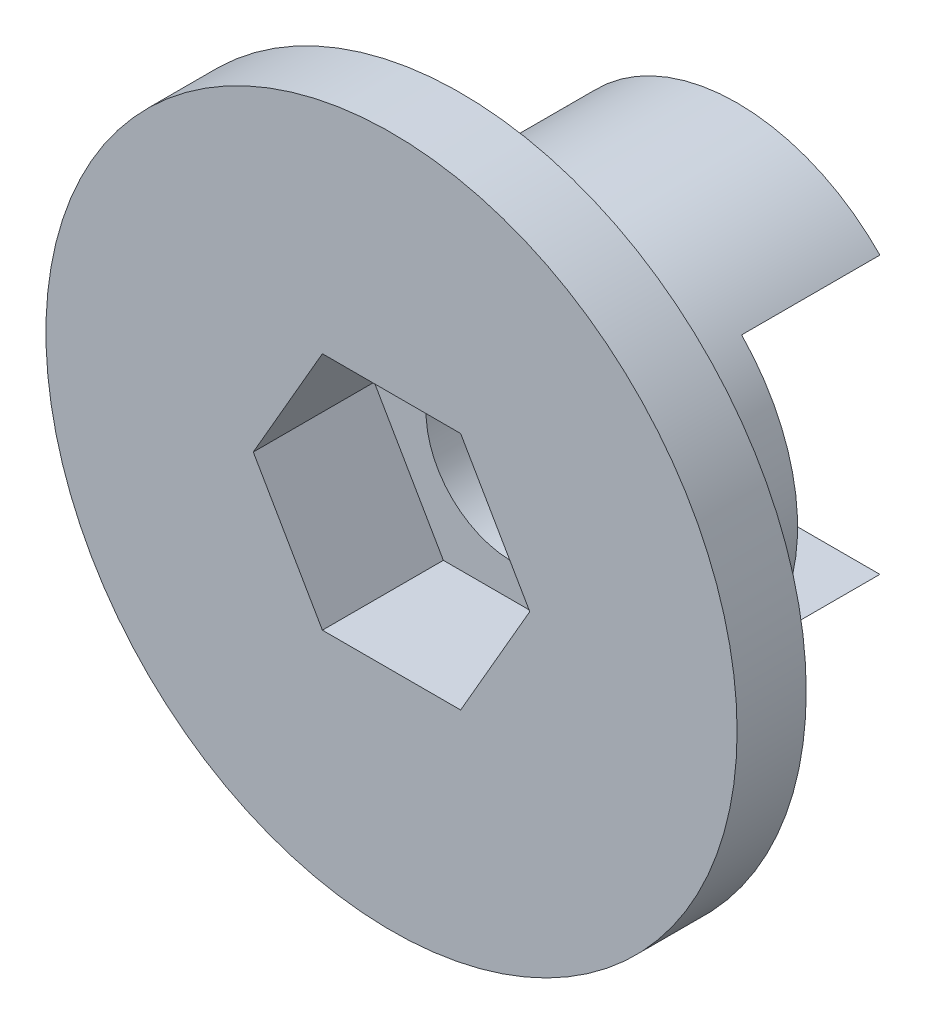
ISO-10303-21;
HEADER;
FILE_DESCRIPTION(('STEP AP214'),'2;1');
FILE_NAME('part.step','',(''),(''),'','','');
FILE_SCHEMA(('AUTOMOTIVE_DESIGN { 1 0 10303 214 1 1 1 1 }'));
ENDSEC;
DATA;
#1=APPLICATION_CONTEXT('core data for automotive mechanical design processes');
#2=APPLICATION_PROTOCOL_DEFINITION('international standard','automotive_design',2000,#1);
#3=PRODUCT_CONTEXT('',#1,'mechanical');
#4=PRODUCT('Part','Part','',(#3));
#5=PRODUCT_RELATED_PRODUCT_CATEGORY('part','',(#4));
#6=PRODUCT_DEFINITION_FORMATION('','',#4);
#7=PRODUCT_DEFINITION_CONTEXT('part definition',#1,'design');
#8=PRODUCT_DEFINITION('design','',#6,#7);
#9=PRODUCT_DEFINITION_SHAPE('','',#8);
#10=(LENGTH_UNIT() NAMED_UNIT(*) SI_UNIT(.MILLI.,.METRE.));
#11=(NAMED_UNIT(*) PLANE_ANGLE_UNIT() SI_UNIT($,.RADIAN.));
#12=(NAMED_UNIT(*) SI_UNIT($,.STERADIAN.) SOLID_ANGLE_UNIT());
#13=UNCERTAINTY_MEASURE_WITH_UNIT(LENGTH_MEASURE(1.E-05),#10,'distance_accuracy_value','');
#14=(GEOMETRIC_REPRESENTATION_CONTEXT(3) GLOBAL_UNCERTAINTY_ASSIGNED_CONTEXT((#13)) GLOBAL_UNIT_ASSIGNED_CONTEXT((#10,
#11,#12)) REPRESENTATION_CONTEXT('',''));
#15=CARTESIAN_POINT('',(0.,0.,0.));
#16=DIRECTION('',(0.,0.,1.));
#17=DIRECTION('',(1.,0.,0.));
#18=AXIS2_PLACEMENT_3D('',#15,#16,#17);
#19=CARTESIAN_POINT('',(0.,0.,20.));
#20=DIRECTION('',(0.,0.,-1.));
#21=DIRECTION('',(-1.,0.,0.));
#22=AXIS2_PLACEMENT_3D('',#19,#20,#21);
#23=CYLINDRICAL_SURFACE('',#22,11.5);
#24=CARTESIAN_POINT('',(0.,0.,8.));
#25=DIRECTION('',(0.,0.,1.));
#26=DIRECTION('',(1.,0.,0.));
#27=AXIS2_PLACEMENT_3D('',#24,#25,#26);
#28=CIRCLE('',#27,11.5);
#29=CARTESIAN_POINT('',(8.26135582092915,-8.,8.));
#30=VERTEX_POINT('',#29);
#31=CARTESIAN_POINT('',(8.26135582092915,8.,8.));
#32=VERTEX_POINT('',#31);
#33=EDGE_CURVE('E111',#30,#32,#28,.T.);
#34=ORIENTED_EDGE('',*,*,#33,.T.);
#35=DIRECTION('',(0.,0.,-1.));
#36=VECTOR('',#35,1.);
#37=CARTESIAN_POINT('',(8.26135582092915,8.,20.));
#38=LINE('',#37,#36);
#39=CARTESIAN_POINT('',(8.26135582092915,8.,0.));
#40=VERTEX_POINT('',#39);
#41=EDGE_CURVE('E40',#32,#40,#38,.T.);
#42=ORIENTED_EDGE('',*,*,#41,.T.);
#43=CARTESIAN_POINT('',(0.,0.,0.));
#44=DIRECTION('',(0.,0.,1.));
#45=DIRECTION('',(1.,0.,0.));
#46=AXIS2_PLACEMENT_3D('',#43,#44,#45);
#47=CIRCLE('',#46,11.5);
#48=CARTESIAN_POINT('',(-8.26135582092915,8.,0.));
#49=VERTEX_POINT('',#48);
#50=EDGE_CURVE('E119',#40,#49,#47,.T.);
#51=ORIENTED_EDGE('',*,*,#50,.T.);
#52=DIRECTION('',(0.,0.,-1.));
#53=VECTOR('',#52,1.);
#54=CARTESIAN_POINT('',(-8.26135582092915,8.,20.));
#55=LINE('',#54,#53);
#56=CARTESIAN_POINT('',(-8.26135582092915,8.,8.));
#57=VERTEX_POINT('',#56);
#58=EDGE_CURVE('E127',#49,#57,#55,.F.);
#59=ORIENTED_EDGE('',*,*,#58,.T.);
#60=CARTESIAN_POINT('',(-8.26135582092915,-8.,8.));
#61=VERTEX_POINT('',#60);
#62=EDGE_CURVE('E47',#57,#61,#28,.T.);
#63=ORIENTED_EDGE('',*,*,#62,.T.);
#64=DIRECTION('',(0.,0.,-1.));
#65=VECTOR('',#64,1.);
#66=CARTESIAN_POINT('',(-8.26135582092915,-8.,20.));
#67=LINE('',#66,#65);
#68=CARTESIAN_POINT('',(-8.26135582092915,-8.,0.));
#69=VERTEX_POINT('',#68);
#70=EDGE_CURVE('E192',#61,#69,#67,.T.);
#71=ORIENTED_EDGE('',*,*,#70,.T.);
#72=CARTESIAN_POINT('',(8.26135582092915,-8.,0.));
#73=VERTEX_POINT('',#72);
#74=EDGE_CURVE('E187',#69,#73,#47,.T.);
#75=ORIENTED_EDGE('',*,*,#74,.T.);
#76=DIRECTION('',(0.,0.,-1.));
#77=VECTOR('',#76,1.);
#78=CARTESIAN_POINT('',(8.26135582092915,-8.,20.));
#79=LINE('',#78,#77);
#80=EDGE_CURVE('E117',#73,#30,#79,.F.);
#81=ORIENTED_EDGE('',*,*,#80,.T.);
#82=EDGE_LOOP('',(#34,#42,#51,#59,#63,#71,#75,#81));
#83=FACE_BOUND('',#82,.T.);
#84=CARTESIAN_POINT('',(0.,0.,16.));
#85=DIRECTION('',(0.,0.,1.));
#86=DIRECTION('',(1.,0.,0.));
#87=AXIS2_PLACEMENT_3D('',#84,#85,#86);
#88=CIRCLE('',#87,11.5);
#89=CARTESIAN_POINT('',(11.5,0.,16.));
#90=VERTEX_POINT('',#89);
#91=EDGE_CURVE('E11',#90,#90,#88,.T.);
#92=ORIENTED_EDGE('',*,*,#91,.F.);
#93=EDGE_LOOP('',(#92));
#94=FACE_BOUND('',#93,.T.);
#95=ADVANCED_FACE('F33',(#83,#94),#23,.T.);
#96=CARTESIAN_POINT('',(0.,0.,0.));
#97=DIRECTION('',(0.,0.,1.));
#98=DIRECTION('',(1.,0.,0.));
#99=AXIS2_PLACEMENT_3D('',#96,#97,#98);
#100=PLANE('',#99);
#101=ORIENTED_EDGE('',*,*,#74,.F.);
#102=DIRECTION('',(1.,0.,0.));
#103=VECTOR('',#102,1.);
#104=CARTESIAN_POINT('',(-11.5,-8.,0.));
#105=LINE('',#104,#103);
#106=EDGE_CURVE('E131',#69,#73,#105,.T.);
#107=ORIENTED_EDGE('',*,*,#106,.T.);
#108=EDGE_LOOP('',(#101,#107));
#109=FACE_BOUND('',#108,.T.);
#110=ADVANCED_FACE('F200',(#109),#100,.F.);
#111=CARTESIAN_POINT('',(0.,0.,20.));
#112=DIRECTION('',(0.,0.,-1.));
#113=DIRECTION('',(-1.,0.,0.));
#114=AXIS2_PLACEMENT_3D('',#111,#112,#113);
#115=CYLINDRICAL_SURFACE('',#114,5.);
#116=CARTESIAN_POINT('',(0.,0.,8.));
#117=DIRECTION('',(0.,0.,1.));
#118=DIRECTION('',(1.,0.,0.));
#119=AXIS2_PLACEMENT_3D('',#116,#117,#118);
#120=CIRCLE('',#119,5.);
#121=CARTESIAN_POINT('',(5.,0.,8.));
#122=VERTEX_POINT('',#121);
#123=EDGE_CURVE('E137',#122,#122,#120,.T.);
#124=ORIENTED_EDGE('',*,*,#123,.F.);
#125=EDGE_LOOP('',(#124));
#126=FACE_BOUND('',#125,.T.);
#127=CARTESIAN_POINT('',(0.,0.,13.));
#128=DIRECTION('',(0.,0.,1.));
#129=DIRECTION('',(1.,0.,0.));
#130=AXIS2_PLACEMENT_3D('',#127,#128,#129);
#131=CIRCLE('',#130,5.);
#132=CARTESIAN_POINT('',(5.,0.,13.));
#133=VERTEX_POINT('',#132);
#134=EDGE_CURVE('E177',#133,#133,#131,.T.);
#135=ORIENTED_EDGE('',*,*,#134,.T.);
#136=EDGE_LOOP('',(#135));
#137=FACE_BOUND('',#136,.T.);
#138=ADVANCED_FACE('F207',(#126,#137),#115,.F.);
#139=CARTESIAN_POINT('',(0.,0.,20.));
#140=DIRECTION('',(0.,0.,1.));
#141=DIRECTION('',(1.,0.,0.));
#142=AXIS2_PLACEMENT_3D('',#139,#140,#141);
#143=PLANE('',#142);
#144=DIRECTION('',(0.5,0.866025403784439,0.));
#145=VECTOR('',#144,1.);
#146=CARTESIAN_POINT('',(4.,-6.92820323027551,20.));
#147=LINE('',#146,#145);
#148=CARTESIAN_POINT('',(4.,-6.92820323027551,20.));
#149=VERTEX_POINT('',#148);
#150=CARTESIAN_POINT('',(8.,0.,20.));
#151=VERTEX_POINT('',#150);
#152=EDGE_CURVE('E55',#149,#151,#147,.T.);
#153=ORIENTED_EDGE('',*,*,#152,.F.);
#154=DIRECTION('',(1.,0.,0.));
#155=VECTOR('',#154,1.);
#156=CARTESIAN_POINT('',(-4.,-6.92820323027551,20.));
#157=LINE('',#156,#155);
#158=CARTESIAN_POINT('',(-4.,-6.92820323027551,20.));
#159=VERTEX_POINT('',#158);
#160=EDGE_CURVE('E144',#159,#149,#157,.T.);
#161=ORIENTED_EDGE('',*,*,#160,.F.);
#162=DIRECTION('',(0.5,-0.866025403784439,0.));
#163=VECTOR('',#162,1.);
#164=CARTESIAN_POINT('',(-8.,0.,20.));
#165=LINE('',#164,#163);
#166=CARTESIAN_POINT('',(-8.,0.,20.));
#167=VERTEX_POINT('',#166);
#168=EDGE_CURVE('E170',#167,#159,#165,.T.);
#169=ORIENTED_EDGE('',*,*,#168,.F.);
#170=DIRECTION('',(-0.5,-0.866025403784439,0.));
#171=VECTOR('',#170,1.);
#172=CARTESIAN_POINT('',(-4.,6.92820323027551,20.));
#173=LINE('',#172,#171);
#174=CARTESIAN_POINT('',(-4.,6.92820323027551,20.));
#175=VERTEX_POINT('',#174);
#176=EDGE_CURVE('E167',#175,#167,#173,.T.);
#177=ORIENTED_EDGE('',*,*,#176,.F.);
#178=DIRECTION('',(-1.,0.,0.));
#179=VECTOR('',#178,1.);
#180=CARTESIAN_POINT('',(4.,6.92820323027551,20.));
#181=LINE('',#180,#179);
#182=CARTESIAN_POINT('',(4.,6.92820323027551,20.));
#183=VERTEX_POINT('',#182);
#184=EDGE_CURVE('E164',#183,#175,#181,.T.);
#185=ORIENTED_EDGE('',*,*,#184,.F.);
#186=DIRECTION('',(-0.5,0.866025403784438,0.));
#187=VECTOR('',#186,1.);
#188=CARTESIAN_POINT('',(8.,0.,20.));
#189=LINE('',#188,#187);
#190=EDGE_CURVE('E161',#151,#183,#189,.T.);
#191=ORIENTED_EDGE('',*,*,#190,.F.);
#192=EDGE_LOOP('',(#153,#161,#169,#177,#185,#191));
#193=FACE_BOUND('',#192,.T.);
#194=CARTESIAN_POINT('',(0.,0.,20.));
#195=DIRECTION('',(0.,0.,1.));
#196=DIRECTION('',(1.,0.,0.));
#197=AXIS2_PLACEMENT_3D('',#194,#195,#196);
#198=CIRCLE('',#197,20.);
#199=CARTESIAN_POINT('',(20.,0.,20.));
#200=VERTEX_POINT('',#199);
#201=EDGE_CURVE('E307',#200,#200,#198,.T.);
#202=ORIENTED_EDGE('',*,*,#201,.T.);
#203=EDGE_LOOP('',(#202));
#204=FACE_BOUND('',#203,.T.);
#205=ADVANCED_FACE('F199',(#193,#204),#143,.T.);
#206=ORIENTED_EDGE('',*,*,#50,.F.);
#207=DIRECTION('',(1.,0.,0.));
#208=VECTOR('',#207,1.);
#209=CARTESIAN_POINT('',(-11.5,8.,0.));
#210=LINE('',#209,#208);
#211=EDGE_CURVE('E126',#49,#40,#210,.T.);
#212=ORIENTED_EDGE('',*,*,#211,.F.);
#213=EDGE_LOOP('',(#206,#212));
#214=FACE_BOUND('',#213,.T.);
#215=ADVANCED_FACE('F196',(#214),#100,.F.);
#216=CARTESIAN_POINT('',(4.,-6.92820323027551,13.));
#217=DIRECTION('',(0.866025403784439,-0.5,0.));
#218=DIRECTION('',(0.5,0.866025403784439,0.));
#219=AXIS2_PLACEMENT_3D('',#216,#217,#218);
#220=PLANE('',#219);
#221=ORIENTED_EDGE('',*,*,#152,.T.);
#222=DIRECTION('',(0.,0.,1.));
#223=VECTOR('',#222,1.);
#224=CARTESIAN_POINT('',(8.,0.,13.));
#225=LINE('',#224,#223);
#226=CARTESIAN_POINT('',(8.,0.,13.));
#227=VERTEX_POINT('',#226);
#228=EDGE_CURVE('E159',#227,#151,#225,.T.);
#229=ORIENTED_EDGE('',*,*,#228,.F.);
#230=DIRECTION('',(0.5,0.866025403784439,0.));
#231=VECTOR('',#230,1.);
#232=CARTESIAN_POINT('',(4.,-6.92820323027551,13.));
#233=LINE('',#232,#231);
#234=CARTESIAN_POINT('',(4.,-6.92820323027551,13.));
#235=VERTEX_POINT('',#234);
#236=EDGE_CURVE('E140',#235,#227,#233,.T.);
#237=ORIENTED_EDGE('',*,*,#236,.F.);
#238=DIRECTION('',(0.,0.,1.));
#239=VECTOR('',#238,1.);
#240=CARTESIAN_POINT('',(4.,-6.92820323027551,13.));
#241=LINE('',#240,#239);
#242=EDGE_CURVE('E175',#235,#149,#241,.T.);
#243=ORIENTED_EDGE('',*,*,#242,.T.);
#244=EDGE_LOOP('',(#221,#229,#237,#243));
#245=FACE_BOUND('',#244,.T.);
#246=ADVANCED_FACE('F198',(#245),#220,.F.);
#247=CARTESIAN_POINT('',(-4.,-6.92820323027551,13.));
#248=DIRECTION('',(0.,-1.,0.));
#249=DIRECTION('',(0.,0.,-1.));
#250=AXIS2_PLACEMENT_3D('',#247,#248,#249);
#251=PLANE('',#250);
#252=ORIENTED_EDGE('',*,*,#160,.T.);
#253=ORIENTED_EDGE('',*,*,#242,.F.);
#254=DIRECTION('',(1.,0.,0.));
#255=VECTOR('',#254,1.);
#256=CARTESIAN_POINT('',(-4.,-6.92820323027551,13.));
#257=LINE('',#256,#255);
#258=CARTESIAN_POINT('',(-4.,-6.92820323027551,13.));
#259=VERTEX_POINT('',#258);
#260=EDGE_CURVE('E156',#259,#235,#257,.T.);
#261=ORIENTED_EDGE('',*,*,#260,.F.);
#262=DIRECTION('',(0.,0.,1.));
#263=VECTOR('',#262,1.);
#264=CARTESIAN_POINT('',(-4.,-6.92820323027551,13.));
#265=LINE('',#264,#263);
#266=EDGE_CURVE('E178',#259,#159,#265,.T.);
#267=ORIENTED_EDGE('',*,*,#266,.T.);
#268=EDGE_LOOP('',(#252,#253,#261,#267));
#269=FACE_BOUND('',#268,.T.);
#270=ADVANCED_FACE('F205',(#269),#251,.F.);
#271=CARTESIAN_POINT('',(-8.,0.,13.));
#272=DIRECTION('',(-0.866025403784439,-0.5,0.));
#273=DIRECTION('',(0.5,-0.866025403784439,0.));
#274=AXIS2_PLACEMENT_3D('',#271,#272,#273);
#275=PLANE('',#274);
#276=ORIENTED_EDGE('',*,*,#168,.T.);
#277=ORIENTED_EDGE('',*,*,#266,.F.);
#278=DIRECTION('',(0.5,-0.866025403784439,0.));
#279=VECTOR('',#278,1.);
#280=CARTESIAN_POINT('',(-8.,0.,13.));
#281=LINE('',#280,#279);
#282=CARTESIAN_POINT('',(-8.,0.,13.));
#283=VERTEX_POINT('',#282);
#284=EDGE_CURVE('E153',#283,#259,#281,.T.);
#285=ORIENTED_EDGE('',*,*,#284,.F.);
#286=DIRECTION('',(0.,0.,1.));
#287=VECTOR('',#286,1.);
#288=CARTESIAN_POINT('',(-8.,0.,13.));
#289=LINE('',#288,#287);
#290=EDGE_CURVE('E180',#283,#167,#289,.T.);
#291=ORIENTED_EDGE('',*,*,#290,.T.);
#292=EDGE_LOOP('',(#276,#277,#285,#291));
#293=FACE_BOUND('',#292,.T.);
#294=ADVANCED_FACE('F275',(#293),#275,.F.);
#295=CARTESIAN_POINT('',(-4.,6.92820323027551,13.));
#296=DIRECTION('',(-0.866025403784439,0.5,0.));
#297=DIRECTION('',(-0.5,-0.866025403784439,0.));
#298=AXIS2_PLACEMENT_3D('',#295,#296,#297);
#299=PLANE('',#298);
#300=ORIENTED_EDGE('',*,*,#176,.T.);
#301=ORIENTED_EDGE('',*,*,#290,.F.);
#302=DIRECTION('',(-0.5,-0.866025403784439,0.));
#303=VECTOR('',#302,1.);
#304=CARTESIAN_POINT('',(-4.,6.92820323027551,13.));
#305=LINE('',#304,#303);
#306=CARTESIAN_POINT('',(-4.,6.92820323027551,13.));
#307=VERTEX_POINT('',#306);
#308=EDGE_CURVE('E150',#307,#283,#305,.T.);
#309=ORIENTED_EDGE('',*,*,#308,.F.);
#310=DIRECTION('',(0.,0.,1.));
#311=VECTOR('',#310,1.);
#312=CARTESIAN_POINT('',(-4.,6.92820323027551,13.));
#313=LINE('',#312,#311);
#314=EDGE_CURVE('E182',#307,#175,#313,.T.);
#315=ORIENTED_EDGE('',*,*,#314,.T.);
#316=EDGE_LOOP('',(#300,#301,#309,#315));
#317=FACE_BOUND('',#316,.T.);
#318=ADVANCED_FACE('F279',(#317),#299,.F.);
#319=CARTESIAN_POINT('',(4.,6.92820323027551,13.));
#320=DIRECTION('',(0.,1.,0.));
#321=DIRECTION('',(0.,0.,1.));
#322=AXIS2_PLACEMENT_3D('',#319,#320,#321);
#323=PLANE('',#322);
#324=ORIENTED_EDGE('',*,*,#184,.T.);
#325=ORIENTED_EDGE('',*,*,#314,.F.);
#326=DIRECTION('',(-1.,0.,0.));
#327=VECTOR('',#326,1.);
#328=CARTESIAN_POINT('',(4.,6.92820323027551,13.));
#329=LINE('',#328,#327);
#330=CARTESIAN_POINT('',(4.,6.92820323027551,13.));
#331=VERTEX_POINT('',#330);
#332=EDGE_CURVE('E147',#331,#307,#329,.T.);
#333=ORIENTED_EDGE('',*,*,#332,.F.);
#334=DIRECTION('',(0.,0.,1.));
#335=VECTOR('',#334,1.);
#336=CARTESIAN_POINT('',(4.,6.92820323027551,13.));
#337=LINE('',#336,#335);
#338=EDGE_CURVE('E184',#331,#183,#337,.T.);
#339=ORIENTED_EDGE('',*,*,#338,.T.);
#340=EDGE_LOOP('',(#324,#325,#333,#339));
#341=FACE_BOUND('',#340,.T.);
#342=ADVANCED_FACE('F283',(#341),#323,.F.);
#343=CARTESIAN_POINT('',(8.,0.,13.));
#344=DIRECTION('',(0.866025403784438,0.5,0.));
#345=DIRECTION('',(-0.5,0.866025403784438,0.));
#346=AXIS2_PLACEMENT_3D('',#343,#344,#345);
#347=PLANE('',#346);
#348=ORIENTED_EDGE('',*,*,#190,.T.);
#349=ORIENTED_EDGE('',*,*,#338,.F.);
#350=DIRECTION('',(-0.5,0.866025403784438,0.));
#351=VECTOR('',#350,1.);
#352=CARTESIAN_POINT('',(8.,0.,13.));
#353=LINE('',#352,#351);
#354=EDGE_CURVE('E143',#227,#331,#353,.T.);
#355=ORIENTED_EDGE('',*,*,#354,.F.);
#356=ORIENTED_EDGE('',*,*,#228,.T.);
#357=EDGE_LOOP('',(#348,#349,#355,#356));
#358=FACE_BOUND('',#357,.T.);
#359=ADVANCED_FACE('F271',(#358),#347,.F.);
#360=CARTESIAN_POINT('',(0.,0.,13.));
#361=DIRECTION('',(0.,0.,1.));
#362=DIRECTION('',(1.,0.,0.));
#363=AXIS2_PLACEMENT_3D('',#360,#361,#362);
#364=PLANE('',#363);
#365=ORIENTED_EDGE('',*,*,#134,.F.);
#366=EDGE_LOOP('',(#365));
#367=FACE_BOUND('',#366,.T.);
#368=ORIENTED_EDGE('',*,*,#236,.T.);
#369=ORIENTED_EDGE('',*,*,#354,.T.);
#370=ORIENTED_EDGE('',*,*,#332,.T.);
#371=ORIENTED_EDGE('',*,*,#308,.T.);
#372=ORIENTED_EDGE('',*,*,#284,.T.);
#373=ORIENTED_EDGE('',*,*,#260,.T.);
#374=EDGE_LOOP('',(#368,#369,#370,#371,#372,#373));
#375=FACE_BOUND('',#374,.T.);
#376=ADVANCED_FACE('F263',(#367,#375),#364,.T.);
#377=CARTESIAN_POINT('',(-11.5,-8.,0.));
#378=DIRECTION('',(0.,-1.,0.));
#379=DIRECTION('',(0.,0.,-1.));
#380=AXIS2_PLACEMENT_3D('',#377,#378,#379);
#381=PLANE('',#380);
#382=DIRECTION('',(1.,0.,0.));
#383=VECTOR('',#382,1.);
#384=CARTESIAN_POINT('',(-11.5,-8.,8.));
#385=LINE('',#384,#383);
#386=EDGE_CURVE('E129',#61,#30,#385,.T.);
#387=ORIENTED_EDGE('',*,*,#386,.T.);
#388=ORIENTED_EDGE('',*,*,#80,.F.);
#389=ORIENTED_EDGE('',*,*,#106,.F.);
#390=ORIENTED_EDGE('',*,*,#70,.F.);
#391=EDGE_LOOP('',(#387,#388,#389,#390));
#392=FACE_BOUND('',#391,.T.);
#393=ADVANCED_FACE('F260',(#392),#381,.F.);
#394=CARTESIAN_POINT('',(-11.5,8.,8.));
#395=DIRECTION('',(0.,0.,1.));
#396=DIRECTION('',(1.,0.,0.));
#397=AXIS2_PLACEMENT_3D('',#394,#395,#396);
#398=PLANE('',#397);
#399=ORIENTED_EDGE('',*,*,#123,.T.);
#400=EDGE_LOOP('',(#399));
#401=FACE_BOUND('',#400,.T.);
#402=DIRECTION('',(1.,0.,0.));
#403=VECTOR('',#402,1.);
#404=CARTESIAN_POINT('',(-11.5,8.,8.));
#405=LINE('',#404,#403);
#406=EDGE_CURVE('E123',#57,#32,#405,.T.);
#407=ORIENTED_EDGE('',*,*,#406,.T.);
#408=ORIENTED_EDGE('',*,*,#33,.F.);
#409=ORIENTED_EDGE('',*,*,#386,.F.);
#410=ORIENTED_EDGE('',*,*,#62,.F.);
#411=EDGE_LOOP('',(#407,#408,#409,#410));
#412=FACE_BOUND('',#411,.T.);
#413=ADVANCED_FACE('F128',(#401,#412),#398,.F.);
#414=CARTESIAN_POINT('',(-11.5,8.,0.));
#415=DIRECTION('',(0.,1.,0.));
#416=DIRECTION('',(0.,0.,1.));
#417=AXIS2_PLACEMENT_3D('',#414,#415,#416);
#418=PLANE('',#417);
#419=ORIENTED_EDGE('',*,*,#406,.F.);
#420=ORIENTED_EDGE('',*,*,#58,.F.);
#421=ORIENTED_EDGE('',*,*,#211,.T.);
#422=ORIENTED_EDGE('',*,*,#41,.F.);
#423=EDGE_LOOP('',(#419,#420,#421,#422));
#424=FACE_BOUND('',#423,.T.);
#425=ADVANCED_FACE('F122',(#424),#418,.F.);
#426=CARTESIAN_POINT('',(0.,0.,16.));
#427=DIRECTION('',(0.,0.,1.));
#428=DIRECTION('',(1.,0.,0.));
#429=AXIS2_PLACEMENT_3D('',#426,#427,#428);
#430=CYLINDRICAL_SURFACE('',#429,20.);
#431=CARTESIAN_POINT('',(0.,0.,16.));
#432=DIRECTION('',(0.,0.,1.));
#433=DIRECTION('',(1.,0.,0.));
#434=AXIS2_PLACEMENT_3D('',#431,#432,#433);
#435=CIRCLE('',#434,20.);
#436=CARTESIAN_POINT('',(20.,0.,16.));
#437=VERTEX_POINT('',#436);
#438=EDGE_CURVE('E133',#437,#437,#435,.T.);
#439=ORIENTED_EDGE('',*,*,#438,.T.);
#440=EDGE_LOOP('',(#439));
#441=FACE_BOUND('',#440,.T.);
#442=ORIENTED_EDGE('',*,*,#201,.F.);
#443=EDGE_LOOP('',(#442));
#444=FACE_BOUND('',#443,.T.);
#445=ADVANCED_FACE('F239',(#441,#444),#430,.T.);
#446=CARTESIAN_POINT('',(0.,0.,16.));
#447=DIRECTION('',(0.,0.,1.));
#448=DIRECTION('',(1.,0.,0.));
#449=AXIS2_PLACEMENT_3D('',#446,#447,#448);
#450=PLANE('',#449);
#451=ORIENTED_EDGE('',*,*,#91,.T.);
#452=EDGE_LOOP('',(#451));
#453=FACE_BOUND('',#452,.T.);
#454=ORIENTED_EDGE('',*,*,#438,.F.);
#455=EDGE_LOOP('',(#454));
#456=FACE_BOUND('',#455,.T.);
#457=ADVANCED_FACE('F243',(#453,#456),#450,.F.);
#458=CLOSED_SHELL('',(#95,#110,#138,#205,#215,#246,#270,#294,#318,#342,#359,#376,#393,#413,#425,
#445,#457));
#459=MANIFOLD_SOLID_BREP('B2',#458);
#460=ADVANCED_BREP_SHAPE_REPRESENTATION('',(#18,#459),#14);
#461=SHAPE_DEFINITION_REPRESENTATION(#9,#460);
ENDSEC;
END-ISO-10303-21;
